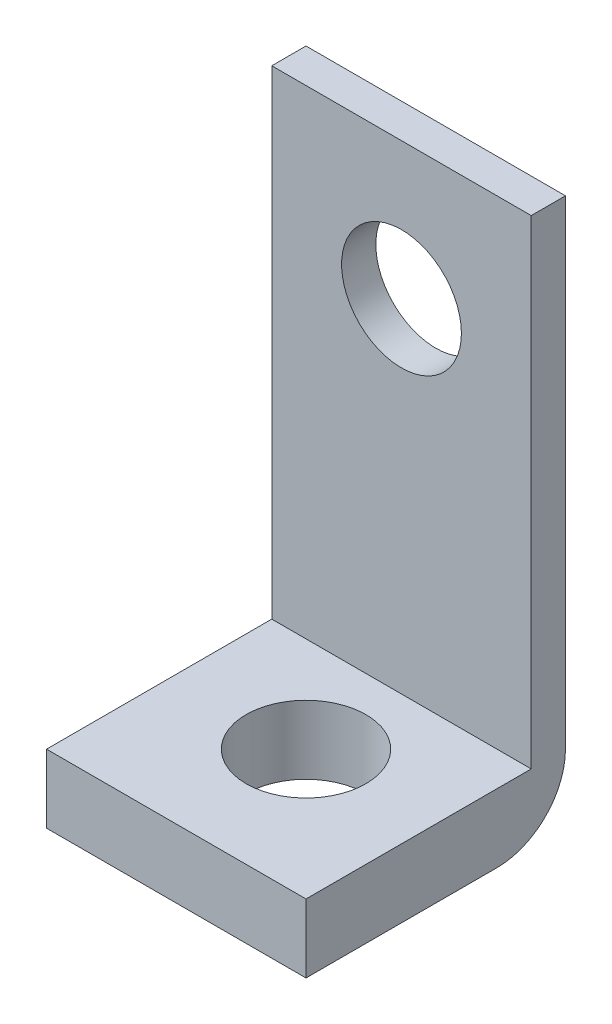
ISO-10303-21;
HEADER;
FILE_DESCRIPTION(('STEP AP214'),'2;1');
FILE_NAME('part.step','',(''),(''),'','','');
FILE_SCHEMA(('AUTOMOTIVE_DESIGN { 1 0 10303 214 1 1 1 1 }'));
ENDSEC;
DATA;
#1=APPLICATION_CONTEXT('core data for automotive mechanical design processes');
#2=APPLICATION_PROTOCOL_DEFINITION('international standard','automotive_design',2000,#1);
#3=PRODUCT_CONTEXT('',#1,'mechanical');
#4=PRODUCT('Part','Part','',(#3));
#5=PRODUCT_RELATED_PRODUCT_CATEGORY('part','',(#4));
#6=PRODUCT_DEFINITION_FORMATION('','',#4);
#7=PRODUCT_DEFINITION_CONTEXT('part definition',#1,'design');
#8=PRODUCT_DEFINITION('design','',#6,#7);
#9=PRODUCT_DEFINITION_SHAPE('','',#8);
#10=(LENGTH_UNIT() NAMED_UNIT(*) SI_UNIT(.MILLI.,.METRE.));
#11=(NAMED_UNIT(*) PLANE_ANGLE_UNIT() SI_UNIT($,.RADIAN.));
#12=(NAMED_UNIT(*) SI_UNIT($,.STERADIAN.) SOLID_ANGLE_UNIT());
#13=UNCERTAINTY_MEASURE_WITH_UNIT(LENGTH_MEASURE(1.E-05),#10,'distance_accuracy_value','');
#14=(GEOMETRIC_REPRESENTATION_CONTEXT(3) GLOBAL_UNCERTAINTY_ASSIGNED_CONTEXT((#13)) GLOBAL_UNIT_ASSIGNED_CONTEXT((#10,
#11,#12)) REPRESENTATION_CONTEXT('',''));
#15=CARTESIAN_POINT('',(0.,0.,0.));
#16=DIRECTION('',(0.,0.,1.));
#17=DIRECTION('',(1.,0.,0.));
#18=AXIS2_PLACEMENT_3D('',#15,#16,#17);
#19=CARTESIAN_POINT('',(-4.8133,2.54,0.));
#20=DIRECTION('',(-1.,0.,0.));
#21=DIRECTION('',(0.,0.,1.));
#22=AXIS2_PLACEMENT_3D('',#19,#20,#21);
#23=PLANE('',#22);
#24=DIRECTION('',(0.,-1.,0.));
#25=VECTOR('',#24,1.);
#26=CARTESIAN_POINT('',(-4.8133,20.32,-4.8133));
#27=LINE('',#26,#25);
#28=CARTESIAN_POINT('',(-4.8133,20.32,-4.8133));
#29=VERTEX_POINT('',#28);
#30=CARTESIAN_POINT('',(-4.8133,2.54,-4.8133));
#31=VERTEX_POINT('',#30);
#32=EDGE_CURVE('E143',#29,#31,#27,.T.);
#33=ORIENTED_EDGE('',*,*,#32,.T.);
#34=CARTESIAN_POINT('',(-4.8133,2.54,-2.2733));
#35=DIRECTION('',(-1.,0.,0.));
#36=DIRECTION('',(0.,0.,1.));
#37=AXIS2_PLACEMENT_3D('',#34,#35,#36);
#38=CIRCLE('',#37,2.54);
#39=CARTESIAN_POINT('',(-4.8133,0.,-2.2733));
#40=VERTEX_POINT('',#39);
#41=EDGE_CURVE('E68',#31,#40,#38,.T.);
#42=ORIENTED_EDGE('',*,*,#41,.T.);
#43=DIRECTION('',(0.,0.,-1.));
#44=VECTOR('',#43,1.);
#45=CARTESIAN_POINT('',(-4.8133,0.,0.));
#46=LINE('',#45,#44);
#47=CARTESIAN_POINT('',(-4.8133,0.,4.8133));
#48=VERTEX_POINT('',#47);
#49=EDGE_CURVE('E173',#48,#40,#46,.T.);
#50=ORIENTED_EDGE('',*,*,#49,.F.);
#51=DIRECTION('',(0.,-1.,0.));
#52=VECTOR('',#51,1.);
#53=CARTESIAN_POINT('',(-4.8133,2.54,4.8133));
#54=LINE('',#53,#52);
#55=CARTESIAN_POINT('',(-4.8133,2.54,4.8133));
#56=VERTEX_POINT('',#55);
#57=EDGE_CURVE('E184',#56,#48,#54,.T.);
#58=ORIENTED_EDGE('',*,*,#57,.F.);
#59=DIRECTION('',(0.,0.,-1.));
#60=VECTOR('',#59,1.);
#61=CARTESIAN_POINT('',(-4.8133,2.54,0.));
#62=LINE('',#61,#60);
#63=CARTESIAN_POINT('',(-4.8133,2.54,-3.5433));
#64=VERTEX_POINT('',#63);
#65=EDGE_CURVE('E110',#56,#64,#62,.T.);
#66=ORIENTED_EDGE('',*,*,#65,.T.);
#67=DIRECTION('',(0.,-1.,0.));
#68=VECTOR('',#67,1.);
#69=CARTESIAN_POINT('',(-4.8133,20.32,-3.5433));
#70=LINE('',#69,#68);
#71=CARTESIAN_POINT('',(-4.8133,20.32,-3.5433));
#72=VERTEX_POINT('',#71);
#73=EDGE_CURVE('E105',#72,#64,#70,.T.);
#74=ORIENTED_EDGE('',*,*,#73,.F.);
#75=DIRECTION('',(0.,0.,-1.));
#76=VECTOR('',#75,1.);
#77=CARTESIAN_POINT('',(-4.8133,20.32,0.));
#78=LINE('',#77,#76);
#79=EDGE_CURVE('E108',#72,#29,#78,.T.);
#80=ORIENTED_EDGE('',*,*,#79,.T.);
#81=EDGE_LOOP('',(#33,#42,#50,#58,#66,#74,#80));
#82=FACE_BOUND('',#81,.T.);
#83=ADVANCED_FACE('F45',(#82),#23,.T.);
#84=CARTESIAN_POINT('',(0.,2.54,4.8133));
#85=DIRECTION('',(0.,0.,1.));
#86=DIRECTION('',(1.,0.,0.));
#87=AXIS2_PLACEMENT_3D('',#84,#85,#86);
#88=PLANE('',#87);
#89=DIRECTION('',(-1.,0.,0.));
#90=VECTOR('',#89,1.);
#91=CARTESIAN_POINT('',(0.,0.,4.8133));
#92=LINE('',#91,#90);
#93=CARTESIAN_POINT('',(4.8133,0.,4.8133));
#94=VERTEX_POINT('',#93);
#95=EDGE_CURVE('E176',#94,#48,#92,.T.);
#96=ORIENTED_EDGE('',*,*,#95,.F.);
#97=DIRECTION('',(0.,-1.,0.));
#98=VECTOR('',#97,1.);
#99=CARTESIAN_POINT('',(4.8133,2.54,4.8133));
#100=LINE('',#99,#98);
#101=CARTESIAN_POINT('',(4.8133,2.54,4.8133));
#102=VERTEX_POINT('',#101);
#103=EDGE_CURVE('E169',#102,#94,#100,.T.);
#104=ORIENTED_EDGE('',*,*,#103,.F.);
#105=DIRECTION('',(-1.,0.,0.));
#106=VECTOR('',#105,1.);
#107=CARTESIAN_POINT('',(0.,2.54,4.8133));
#108=LINE('',#107,#106);
#109=EDGE_CURVE('E162',#102,#56,#108,.T.);
#110=ORIENTED_EDGE('',*,*,#109,.T.);
#111=ORIENTED_EDGE('',*,*,#57,.T.);
#112=EDGE_LOOP('',(#96,#104,#110,#111));
#113=FACE_BOUND('',#112,.T.);
#114=ADVANCED_FACE('F205',(#113),#88,.T.);
#115=CARTESIAN_POINT('',(0.,2.54,0.));
#116=DIRECTION('',(0.,-1.,0.));
#117=DIRECTION('',(0.,0.,-1.));
#118=AXIS2_PLACEMENT_3D('',#115,#116,#117);
#119=CYLINDRICAL_SURFACE('',#118,2.2225);
#120=CARTESIAN_POINT('',(0.,2.54,0.));
#121=DIRECTION('',(0.,1.,0.));
#122=DIRECTION('',(0.,0.,1.));
#123=AXIS2_PLACEMENT_3D('',#120,#121,#122);
#124=CIRCLE('',#123,2.2225);
#125=CARTESIAN_POINT('',(0.,2.54,2.2225));
#126=VERTEX_POINT('',#125);
#127=EDGE_CURVE('E152',#126,#126,#124,.T.);
#128=ORIENTED_EDGE('',*,*,#127,.T.);
#129=EDGE_LOOP('',(#128));
#130=FACE_BOUND('',#129,.T.);
#131=CARTESIAN_POINT('',(0.,0.,0.));
#132=DIRECTION('',(0.,1.,0.));
#133=DIRECTION('',(0.,0.,1.));
#134=AXIS2_PLACEMENT_3D('',#131,#132,#133);
#135=CIRCLE('',#134,2.2225);
#136=CARTESIAN_POINT('',(0.,0.,2.2225));
#137=VERTEX_POINT('',#136);
#138=EDGE_CURVE('E114',#137,#137,#135,.T.);
#139=ORIENTED_EDGE('',*,*,#138,.F.);
#140=EDGE_LOOP('',(#139));
#141=FACE_BOUND('',#140,.T.);
#142=ADVANCED_FACE('F218',(#130,#141),#119,.F.);
#143=CARTESIAN_POINT('',(4.8133,2.54,0.));
#144=DIRECTION('',(-1.,0.,0.));
#145=DIRECTION('',(0.,0.,1.));
#146=AXIS2_PLACEMENT_3D('',#143,#144,#145);
#147=PLANE('',#146);
#148=DIRECTION('',(0.,0.,-1.));
#149=VECTOR('',#148,1.);
#150=CARTESIAN_POINT('',(4.8133,0.,0.));
#151=LINE('',#150,#149);
#152=CARTESIAN_POINT('',(4.8133,0.,-2.2733));
#153=VERTEX_POINT('',#152);
#154=EDGE_CURVE('E157',#94,#153,#151,.T.);
#155=ORIENTED_EDGE('',*,*,#154,.T.);
#156=CARTESIAN_POINT('',(4.8133,2.54,-2.2733));
#157=DIRECTION('',(-1.,0.,0.));
#158=DIRECTION('',(0.,0.,1.));
#159=AXIS2_PLACEMENT_3D('',#156,#157,#158);
#160=CIRCLE('',#159,2.54);
#161=CARTESIAN_POINT('',(4.8133,2.54,-4.8133));
#162=VERTEX_POINT('',#161);
#163=EDGE_CURVE('E11',#153,#162,#160,.F.);
#164=ORIENTED_EDGE('',*,*,#163,.T.);
#165=DIRECTION('',(0.,-1.,0.));
#166=VECTOR('',#165,1.);
#167=CARTESIAN_POINT('',(4.8133,20.32,-4.8133));
#168=LINE('',#167,#166);
#169=CARTESIAN_POINT('',(4.8133,20.32,-4.8133));
#170=VERTEX_POINT('',#169);
#171=EDGE_CURVE('E146',#170,#162,#168,.T.);
#172=ORIENTED_EDGE('',*,*,#171,.F.);
#173=DIRECTION('',(0.,0.,-1.));
#174=VECTOR('',#173,1.);
#175=CARTESIAN_POINT('',(4.8133,20.32,0.));
#176=LINE('',#175,#174);
#177=CARTESIAN_POINT('',(4.8133,20.32,-3.5433));
#178=VERTEX_POINT('',#177);
#179=EDGE_CURVE('E124',#178,#170,#176,.T.);
#180=ORIENTED_EDGE('',*,*,#179,.F.);
#181=DIRECTION('',(0.,-1.,0.));
#182=VECTOR('',#181,1.);
#183=CARTESIAN_POINT('',(4.8133,20.32,-3.5433));
#184=LINE('',#183,#182);
#185=CARTESIAN_POINT('',(4.8133,2.54,-3.5433));
#186=VERTEX_POINT('',#185);
#187=EDGE_CURVE('E115',#178,#186,#184,.T.);
#188=ORIENTED_EDGE('',*,*,#187,.T.);
#189=DIRECTION('',(0.,0.,-1.));
#190=VECTOR('',#189,1.);
#191=CARTESIAN_POINT('',(4.8133,2.54,0.));
#192=LINE('',#191,#190);
#193=EDGE_CURVE('E166',#102,#186,#192,.T.);
#194=ORIENTED_EDGE('',*,*,#193,.F.);
#195=ORIENTED_EDGE('',*,*,#103,.T.);
#196=EDGE_LOOP('',(#155,#164,#172,#180,#188,#194,#195));
#197=FACE_BOUND('',#196,.T.);
#198=ADVANCED_FACE('F200',(#197),#147,.F.);
#199=CARTESIAN_POINT('',(0.,2.54,0.));
#200=DIRECTION('',(0.,1.,0.));
#201=DIRECTION('',(0.,0.,1.));
#202=AXIS2_PLACEMENT_3D('',#199,#200,#201);
#203=PLANE('',#202);
#204=ORIENTED_EDGE('',*,*,#127,.F.);
#205=EDGE_LOOP('',(#204));
#206=FACE_BOUND('',#205,.T.);
#207=DIRECTION('',(1.,0.,0.));
#208=VECTOR('',#207,1.);
#209=CARTESIAN_POINT('',(0.,2.54,-3.5433));
#210=LINE('',#209,#208);
#211=EDGE_CURVE('E156',#64,#186,#210,.T.);
#212=ORIENTED_EDGE('',*,*,#211,.F.);
#213=ORIENTED_EDGE('',*,*,#65,.F.);
#214=ORIENTED_EDGE('',*,*,#109,.F.);
#215=ORIENTED_EDGE('',*,*,#193,.T.);
#216=EDGE_LOOP('',(#212,#213,#214,#215));
#217=FACE_BOUND('',#216,.T.);
#218=ADVANCED_FACE('F208',(#206,#217),#203,.T.);
#219=CARTESIAN_POINT('',(0.,0.,0.));
#220=DIRECTION('',(0.,1.,0.));
#221=DIRECTION('',(0.,0.,1.));
#222=AXIS2_PLACEMENT_3D('',#219,#220,#221);
#223=PLANE('',#222);
#224=ORIENTED_EDGE('',*,*,#138,.T.);
#225=EDGE_LOOP('',(#224));
#226=FACE_BOUND('',#225,.T.);
#227=ORIENTED_EDGE('',*,*,#49,.T.);
#228=DIRECTION('',(-1.,0.,0.));
#229=VECTOR('',#228,1.);
#230=CARTESIAN_POINT('',(0.,0.,-2.2733));
#231=LINE('',#230,#229);
#232=EDGE_CURVE('E54',#40,#153,#231,.F.);
#233=ORIENTED_EDGE('',*,*,#232,.T.);
#234=ORIENTED_EDGE('',*,*,#154,.F.);
#235=ORIENTED_EDGE('',*,*,#95,.T.);
#236=EDGE_LOOP('',(#227,#233,#234,#235));
#237=FACE_BOUND('',#236,.T.);
#238=ADVANCED_FACE('F203',(#226,#237),#223,.F.);
#239=CARTESIAN_POINT('',(0.,20.32,-3.5433));
#240=DIRECTION('',(0.,0.,-1.));
#241=DIRECTION('',(-1.,0.,0.));
#242=AXIS2_PLACEMENT_3D('',#239,#240,#241);
#243=PLANE('',#242);
#244=CARTESIAN_POINT('',(0.,15.24,-3.5433));
#245=DIRECTION('',(0.,0.,1.));
#246=DIRECTION('',(1.,0.,0.));
#247=AXIS2_PLACEMENT_3D('',#244,#245,#246);
#248=CIRCLE('',#247,2.2225);
#249=CARTESIAN_POINT('',(2.2225,15.24,-3.5433));
#250=VERTEX_POINT('',#249);
#251=EDGE_CURVE('E135',#250,#250,#248,.T.);
#252=ORIENTED_EDGE('',*,*,#251,.F.);
#253=EDGE_LOOP('',(#252));
#254=FACE_BOUND('',#253,.T.);
#255=ORIENTED_EDGE('',*,*,#73,.T.);
#256=ORIENTED_EDGE('',*,*,#211,.T.);
#257=ORIENTED_EDGE('',*,*,#187,.F.);
#258=DIRECTION('',(1.,0.,0.));
#259=VECTOR('',#258,1.);
#260=CARTESIAN_POINT('',(0.,20.32,-3.5433));
#261=LINE('',#260,#259);
#262=EDGE_CURVE('E118',#72,#178,#261,.T.);
#263=ORIENTED_EDGE('',*,*,#262,.F.);
#264=EDGE_LOOP('',(#255,#256,#257,#263));
#265=FACE_BOUND('',#264,.T.);
#266=ADVANCED_FACE('F119',(#254,#265),#243,.F.);
#267=CARTESIAN_POINT('',(0.,20.32,-4.8133));
#268=DIRECTION('',(0.,0.,1.));
#269=DIRECTION('',(1.,0.,0.));
#270=AXIS2_PLACEMENT_3D('',#267,#268,#269);
#271=PLANE('',#270);
#272=CARTESIAN_POINT('',(0.,15.24,-4.8133));
#273=DIRECTION('',(0.,0.,1.));
#274=DIRECTION('',(1.,0.,0.));
#275=AXIS2_PLACEMENT_3D('',#272,#273,#274);
#276=CIRCLE('',#275,2.2225);
#277=CARTESIAN_POINT('',(2.2225,15.24,-4.8133));
#278=VERTEX_POINT('',#277);
#279=EDGE_CURVE('E131',#278,#278,#276,.F.);
#280=ORIENTED_EDGE('',*,*,#279,.F.);
#281=EDGE_LOOP('',(#280));
#282=FACE_BOUND('',#281,.T.);
#283=ORIENTED_EDGE('',*,*,#171,.T.);
#284=DIRECTION('',(-1.,0.,0.));
#285=VECTOR('',#284,1.);
#286=CARTESIAN_POINT('',(0.,2.54,-4.8133));
#287=LINE('',#286,#285);
#288=EDGE_CURVE('E187',#162,#31,#287,.T.);
#289=ORIENTED_EDGE('',*,*,#288,.T.);
#290=ORIENTED_EDGE('',*,*,#32,.F.);
#291=DIRECTION('',(-1.,0.,0.));
#292=VECTOR('',#291,1.);
#293=CARTESIAN_POINT('',(0.,20.32,-4.8133));
#294=LINE('',#293,#292);
#295=EDGE_CURVE('E128',#170,#29,#294,.T.);
#296=ORIENTED_EDGE('',*,*,#295,.F.);
#297=EDGE_LOOP('',(#283,#289,#290,#296));
#298=FACE_BOUND('',#297,.T.);
#299=ADVANCED_FACE('F195',(#282,#298),#271,.F.);
#300=CARTESIAN_POINT('',(0.,20.32,0.));
#301=DIRECTION('',(0.,1.,0.));
#302=DIRECTION('',(0.,0.,1.));
#303=AXIS2_PLACEMENT_3D('',#300,#301,#302);
#304=PLANE('',#303);
#305=ORIENTED_EDGE('',*,*,#79,.F.);
#306=ORIENTED_EDGE('',*,*,#262,.T.);
#307=ORIENTED_EDGE('',*,*,#179,.T.);
#308=ORIENTED_EDGE('',*,*,#295,.T.);
#309=EDGE_LOOP('',(#305,#306,#307,#308));
#310=FACE_BOUND('',#309,.T.);
#311=ADVANCED_FACE('F126',(#310),#304,.T.);
#312=CARTESIAN_POINT('',(0.,15.24,-4.8143));
#313=DIRECTION('',(0.,0.,1.));
#314=DIRECTION('',(1.,0.,0.));
#315=AXIS2_PLACEMENT_3D('',#312,#313,#314);
#316=CYLINDRICAL_SURFACE('',#315,2.2225);
#317=ORIENTED_EDGE('',*,*,#251,.T.);
#318=EDGE_LOOP('',(#317));
#319=FACE_BOUND('',#318,.T.);
#320=ORIENTED_EDGE('',*,*,#279,.T.);
#321=EDGE_LOOP('',(#320));
#322=FACE_BOUND('',#321,.T.);
#323=ADVANCED_FACE('F273',(#319,#322),#316,.F.);
#324=CARTESIAN_POINT('',(0.,2.54,-2.2733));
#325=DIRECTION('',(-1.,0.,0.));
#326=DIRECTION('',(0.,0.,1.));
#327=AXIS2_PLACEMENT_3D('',#324,#325,#326);
#328=CYLINDRICAL_SURFACE('',#327,2.54);
#329=ORIENTED_EDGE('',*,*,#163,.F.);
#330=ORIENTED_EDGE('',*,*,#232,.F.);
#331=ORIENTED_EDGE('',*,*,#41,.F.);
#332=ORIENTED_EDGE('',*,*,#288,.F.);
#333=EDGE_LOOP('',(#329,#330,#331,#332));
#334=FACE_BOUND('',#333,.T.);
#335=ADVANCED_FACE('F47',(#334),#328,.T.);
#336=CLOSED_SHELL('',(#83,#114,#142,#198,#218,#238,#266,#299,#311,#323,#335));
#337=MANIFOLD_SOLID_BREP('B2',#336);
#338=ADVANCED_BREP_SHAPE_REPRESENTATION('',(#18,#337),#14);
#339=SHAPE_DEFINITION_REPRESENTATION(#9,#338);
ENDSEC;
END-ISO-10303-21;
